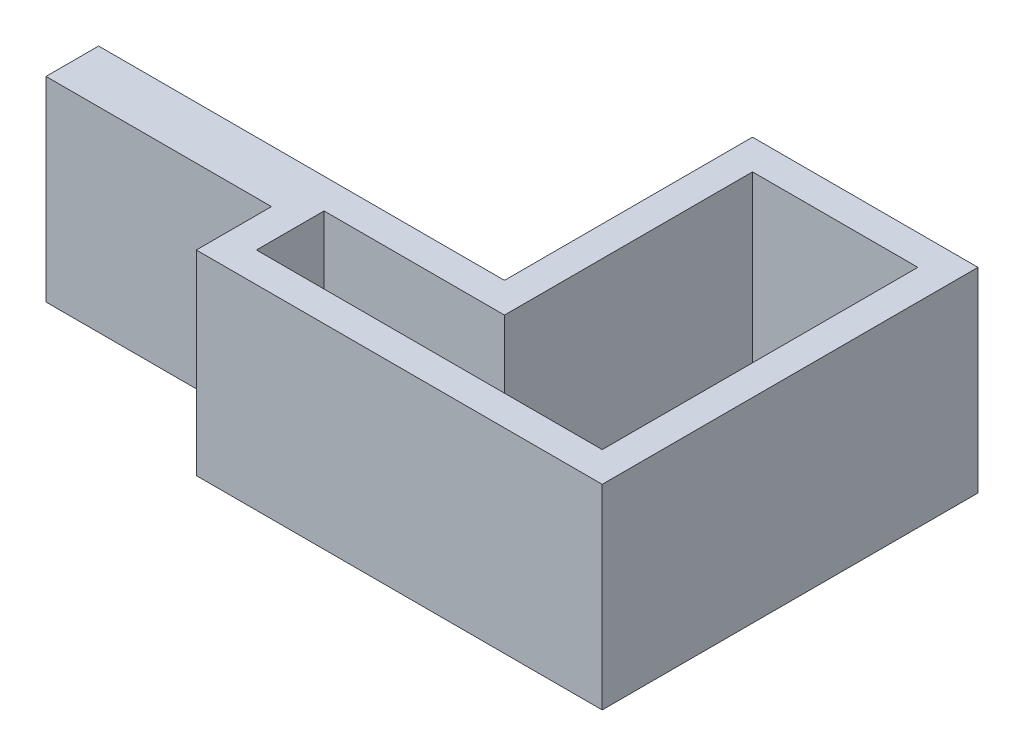
ISO-10303-21;
HEADER;
FILE_DESCRIPTION(('STEP AP214'),'2;1');
FILE_NAME('part.step','',(''),(''),'','','');
FILE_SCHEMA(('AUTOMOTIVE_DESIGN { 1 0 10303 214 1 1 1 1 }'));
ENDSEC;
DATA;
#1=APPLICATION_CONTEXT('core data for automotive mechanical design processes');
#2=APPLICATION_PROTOCOL_DEFINITION('international standard','automotive_design',2000,#1);
#3=PRODUCT_CONTEXT('',#1,'mechanical');
#4=PRODUCT('Part','Part','',(#3));
#5=PRODUCT_RELATED_PRODUCT_CATEGORY('part','',(#4));
#6=PRODUCT_DEFINITION_FORMATION('','',#4);
#7=PRODUCT_DEFINITION_CONTEXT('part definition',#1,'design');
#8=PRODUCT_DEFINITION('design','',#6,#7);
#9=PRODUCT_DEFINITION_SHAPE('','',#8);
#10=(LENGTH_UNIT() NAMED_UNIT(*) SI_UNIT(.MILLI.,.METRE.));
#11=(NAMED_UNIT(*) PLANE_ANGLE_UNIT() SI_UNIT($,.RADIAN.));
#12=(NAMED_UNIT(*) SI_UNIT($,.STERADIAN.) SOLID_ANGLE_UNIT());
#13=UNCERTAINTY_MEASURE_WITH_UNIT(LENGTH_MEASURE(1.E-05),#10,'distance_accuracy_value','');
#14=(GEOMETRIC_REPRESENTATION_CONTEXT(3) GLOBAL_UNCERTAINTY_ASSIGNED_CONTEXT((#13)) GLOBAL_UNIT_ASSIGNED_CONTEXT((#10,
#11,#12)) REPRESENTATION_CONTEXT('',''));
#15=CARTESIAN_POINT('',(0.,0.,0.));
#16=DIRECTION('',(0.,0.,1.));
#17=DIRECTION('',(1.,0.,0.));
#18=AXIS2_PLACEMENT_3D('',#15,#16,#17);
#19=CARTESIAN_POINT('',(0.,13.,22.));
#20=DIRECTION('',(-1.,0.,0.));
#21=DIRECTION('',(0.,0.,-1.));
#22=AXIS2_PLACEMENT_3D('',#19,#20,#21);
#23=PLANE('',#22);
#24=DIRECTION('',(0.,0.,1.));
#25=VECTOR('',#24,1.);
#26=CARTESIAN_POINT('',(0.,0.,22.));
#27=LINE('',#26,#25);
#28=CARTESIAN_POINT('',(0.,0.,11.));
#29=VERTEX_POINT('',#28);
#30=CARTESIAN_POINT('',(0.,0.,36.));
#31=VERTEX_POINT('',#30);
#32=EDGE_CURVE('E250',#29,#31,#27,.T.);
#33=ORIENTED_EDGE('',*,*,#32,.F.);
#34=DIRECTION('',(0.,-1.,0.));
#35=VECTOR('',#34,1.);
#36=CARTESIAN_POINT('',(0.,13.,11.));
#37=LINE('',#36,#35);
#38=CARTESIAN_POINT('',(0.,13.,11.));
#39=VERTEX_POINT('',#38);
#40=EDGE_CURVE('E275',#39,#29,#37,.T.);
#41=ORIENTED_EDGE('',*,*,#40,.F.);
#42=DIRECTION('',(0.,0.,1.));
#43=VECTOR('',#42,1.);
#44=CARTESIAN_POINT('',(0.,13.,22.));
#45=LINE('',#44,#43);
#46=CARTESIAN_POINT('',(0.,13.,36.));
#47=VERTEX_POINT('',#46);
#48=EDGE_CURVE('E251',#39,#47,#45,.T.);
#49=ORIENTED_EDGE('',*,*,#48,.T.);
#50=DIRECTION('',(0.,-1.,0.));
#51=VECTOR('',#50,1.);
#52=CARTESIAN_POINT('',(0.,13.,36.));
#53=LINE('',#52,#51);
#54=EDGE_CURVE('E12',#47,#31,#53,.T.);
#55=ORIENTED_EDGE('',*,*,#54,.T.);
#56=EDGE_LOOP('',(#33,#41,#49,#55));
#57=FACE_BOUND('',#56,.T.);
#58=ADVANCED_FACE('F39',(#57),#23,.F.);
#59=CARTESIAN_POINT('',(0.,13.,36.));
#60=DIRECTION('',(0.,0.,-1.));
#61=DIRECTION('',(1.,0.,0.));
#62=AXIS2_PLACEMENT_3D('',#59,#60,#61);
#63=PLANE('',#62);
#64=DIRECTION('',(-1.,0.,0.));
#65=VECTOR('',#64,1.);
#66=CARTESIAN_POINT('',(0.,0.,36.));
#67=LINE('',#66,#65);
#68=CARTESIAN_POINT('',(-27.,0.,36.));
#69=VERTEX_POINT('',#68);
#70=EDGE_CURVE('E278',#31,#69,#67,.T.);
#71=ORIENTED_EDGE('',*,*,#70,.F.);
#72=ORIENTED_EDGE('',*,*,#54,.F.);
#73=DIRECTION('',(-1.,0.,0.));
#74=VECTOR('',#73,1.);
#75=CARTESIAN_POINT('',(0.,13.,36.));
#76=LINE('',#75,#74);
#77=CARTESIAN_POINT('',(-27.,13.,36.));
#78=VERTEX_POINT('',#77);
#79=EDGE_CURVE('E254',#47,#78,#76,.T.);
#80=ORIENTED_EDGE('',*,*,#79,.T.);
#81=DIRECTION('',(0.,-1.,0.));
#82=VECTOR('',#81,1.);
#83=CARTESIAN_POINT('',(-27.,13.,36.));
#84=LINE('',#83,#82);
#85=EDGE_CURVE('E46',#78,#69,#84,.T.);
#86=ORIENTED_EDGE('',*,*,#85,.T.);
#87=EDGE_LOOP('',(#71,#72,#80,#86));
#88=FACE_BOUND('',#87,.T.);
#89=ADVANCED_FACE('F316',(#88),#63,.F.);
#90=CARTESIAN_POINT('',(-27.,13.,36.));
#91=DIRECTION('',(1.,0.,0.));
#92=DIRECTION('',(0.,0.,1.));
#93=AXIS2_PLACEMENT_3D('',#90,#91,#92);
#94=PLANE('',#93);
#95=DIRECTION('',(0.,0.,-1.));
#96=VECTOR('',#95,1.);
#97=CARTESIAN_POINT('',(-27.,0.,36.));
#98=LINE('',#97,#96);
#99=CARTESIAN_POINT('',(-27.,0.,31.));
#100=VERTEX_POINT('',#99);
#101=EDGE_CURVE('E281',#69,#100,#98,.T.);
#102=ORIENTED_EDGE('',*,*,#101,.F.);
#103=ORIENTED_EDGE('',*,*,#85,.F.);
#104=DIRECTION('',(0.,0.,-1.));
#105=VECTOR('',#104,1.);
#106=CARTESIAN_POINT('',(-27.,13.,36.));
#107=LINE('',#106,#105);
#108=CARTESIAN_POINT('',(-27.,13.,31.));
#109=VERTEX_POINT('',#108);
#110=EDGE_CURVE('E258',#78,#109,#107,.T.);
#111=ORIENTED_EDGE('',*,*,#110,.T.);
#112=DIRECTION('',(0.,-1.,0.));
#113=VECTOR('',#112,1.);
#114=CARTESIAN_POINT('',(-27.,13.,31.));
#115=LINE('',#114,#113);
#116=EDGE_CURVE('E311',#109,#100,#115,.T.);
#117=ORIENTED_EDGE('',*,*,#116,.T.);
#118=EDGE_LOOP('',(#102,#103,#111,#117));
#119=FACE_BOUND('',#118,.T.);
#120=ADVANCED_FACE('F329',(#119),#94,.F.);
#121=CARTESIAN_POINT('',(-27.,13.,31.));
#122=DIRECTION('',(0.,0.,-1.));
#123=DIRECTION('',(1.,0.,0.));
#124=AXIS2_PLACEMENT_3D('',#121,#122,#123);
#125=PLANE('',#124);
#126=DIRECTION('',(-1.,0.,0.));
#127=VECTOR('',#126,1.);
#128=CARTESIAN_POINT('',(-27.,0.,31.));
#129=LINE('',#128,#127);
#130=CARTESIAN_POINT('',(-42.,0.,31.));
#131=VERTEX_POINT('',#130);
#132=EDGE_CURVE('E284',#100,#131,#129,.T.);
#133=ORIENTED_EDGE('',*,*,#132,.F.);
#134=ORIENTED_EDGE('',*,*,#116,.F.);
#135=DIRECTION('',(-1.,0.,0.));
#136=VECTOR('',#135,1.);
#137=CARTESIAN_POINT('',(-27.,13.,31.));
#138=LINE('',#137,#136);
#139=CARTESIAN_POINT('',(-42.,13.,31.));
#140=VERTEX_POINT('',#139);
#141=EDGE_CURVE('E261',#109,#140,#138,.T.);
#142=ORIENTED_EDGE('',*,*,#141,.T.);
#143=DIRECTION('',(0.,-1.,0.));
#144=VECTOR('',#143,1.);
#145=CARTESIAN_POINT('',(-42.,13.,31.));
#146=LINE('',#145,#144);
#147=EDGE_CURVE('E308',#140,#131,#146,.T.);
#148=ORIENTED_EDGE('',*,*,#147,.T.);
#149=EDGE_LOOP('',(#133,#134,#142,#148));
#150=FACE_BOUND('',#149,.T.);
#151=ADVANCED_FACE('F331',(#150),#125,.F.);
#152=CARTESIAN_POINT('',(-42.,13.,31.));
#153=DIRECTION('',(1.,0.,0.));
#154=DIRECTION('',(0.,0.,1.));
#155=AXIS2_PLACEMENT_3D('',#152,#153,#154);
#156=PLANE('',#155);
#157=DIRECTION('',(0.,0.,-1.));
#158=VECTOR('',#157,1.);
#159=CARTESIAN_POINT('',(-42.,0.,31.));
#160=LINE('',#159,#158);
#161=CARTESIAN_POINT('',(-42.,0.,27.5));
#162=VERTEX_POINT('',#161);
#163=EDGE_CURVE('E287',#131,#162,#160,.T.);
#164=ORIENTED_EDGE('',*,*,#163,.F.);
#165=ORIENTED_EDGE('',*,*,#147,.F.);
#166=DIRECTION('',(0.,0.,-1.));
#167=VECTOR('',#166,1.);
#168=CARTESIAN_POINT('',(-42.,13.,31.));
#169=LINE('',#168,#167);
#170=CARTESIAN_POINT('',(-42.,13.,27.5));
#171=VERTEX_POINT('',#170);
#172=EDGE_CURVE('E264',#140,#171,#169,.T.);
#173=ORIENTED_EDGE('',*,*,#172,.T.);
#174=DIRECTION('',(0.,-1.,0.));
#175=VECTOR('',#174,1.);
#176=CARTESIAN_POINT('',(-42.,13.,27.5));
#177=LINE('',#176,#175);
#178=EDGE_CURVE('E305',#171,#162,#177,.T.);
#179=ORIENTED_EDGE('',*,*,#178,.T.);
#180=EDGE_LOOP('',(#164,#165,#173,#179));
#181=FACE_BOUND('',#180,.T.);
#182=ADVANCED_FACE('F334',(#181),#156,.F.);
#183=CARTESIAN_POINT('',(-42.,13.,27.5));
#184=DIRECTION('',(0.,0.,1.));
#185=DIRECTION('',(-1.,0.,0.));
#186=AXIS2_PLACEMENT_3D('',#183,#184,#185);
#187=PLANE('',#186);
#188=DIRECTION('',(1.,0.,0.));
#189=VECTOR('',#188,1.);
#190=CARTESIAN_POINT('',(-42.,0.,27.5));
#191=LINE('',#190,#189);
#192=CARTESIAN_POINT('',(-15.,0.,27.5));
#193=VERTEX_POINT('',#192);
#194=EDGE_CURVE('E290',#162,#193,#191,.T.);
#195=ORIENTED_EDGE('',*,*,#194,.F.);
#196=ORIENTED_EDGE('',*,*,#178,.F.);
#197=DIRECTION('',(1.,0.,0.));
#198=VECTOR('',#197,1.);
#199=CARTESIAN_POINT('',(-42.,13.,27.5));
#200=LINE('',#199,#198);
#201=CARTESIAN_POINT('',(-15.,13.,27.5));
#202=VERTEX_POINT('',#201);
#203=EDGE_CURVE('E267',#171,#202,#200,.T.);
#204=ORIENTED_EDGE('',*,*,#203,.T.);
#205=DIRECTION('',(0.,-1.,0.));
#206=VECTOR('',#205,1.);
#207=CARTESIAN_POINT('',(-15.,13.,27.5));
#208=LINE('',#207,#206);
#209=EDGE_CURVE('E302',#202,#193,#208,.T.);
#210=ORIENTED_EDGE('',*,*,#209,.T.);
#211=EDGE_LOOP('',(#195,#196,#204,#210));
#212=FACE_BOUND('',#211,.T.);
#213=ADVANCED_FACE('F337',(#212),#187,.F.);
#214=CARTESIAN_POINT('',(-15.,13.,11.));
#215=DIRECTION('',(1.,0.,0.));
#216=DIRECTION('',(0.,0.,1.));
#217=AXIS2_PLACEMENT_3D('',#214,#215,#216);
#218=PLANE('',#217);
#219=DIRECTION('',(0.,0.,-1.));
#220=VECTOR('',#219,1.);
#221=CARTESIAN_POINT('',(-15.,0.,11.));
#222=LINE('',#221,#220);
#223=CARTESIAN_POINT('',(-15.,0.,11.));
#224=VERTEX_POINT('',#223);
#225=EDGE_CURVE('E293',#193,#224,#222,.T.);
#226=ORIENTED_EDGE('',*,*,#225,.F.);
#227=ORIENTED_EDGE('',*,*,#209,.F.);
#228=DIRECTION('',(0.,0.,-1.));
#229=VECTOR('',#228,1.);
#230=CARTESIAN_POINT('',(-15.,13.,11.));
#231=LINE('',#230,#229);
#232=CARTESIAN_POINT('',(-15.,13.,11.));
#233=VERTEX_POINT('',#232);
#234=EDGE_CURVE('E270',#202,#233,#231,.T.);
#235=ORIENTED_EDGE('',*,*,#234,.T.);
#236=DIRECTION('',(0.,-1.,0.));
#237=VECTOR('',#236,1.);
#238=CARTESIAN_POINT('',(-15.,13.,11.));
#239=LINE('',#238,#237);
#240=EDGE_CURVE('E299',#233,#224,#239,.T.);
#241=ORIENTED_EDGE('',*,*,#240,.T.);
#242=EDGE_LOOP('',(#226,#227,#235,#241));
#243=FACE_BOUND('',#242,.T.);
#244=ADVANCED_FACE('F340',(#243),#218,.F.);
#245=CARTESIAN_POINT('',(0.,13.,11.));
#246=DIRECTION('',(0.,0.,1.));
#247=DIRECTION('',(-1.,0.,0.));
#248=AXIS2_PLACEMENT_3D('',#245,#246,#247);
#249=PLANE('',#248);
#250=DIRECTION('',(1.,0.,0.));
#251=VECTOR('',#250,1.);
#252=CARTESIAN_POINT('',(0.,0.,11.));
#253=LINE('',#252,#251);
#254=EDGE_CURVE('E255',#224,#29,#253,.T.);
#255=ORIENTED_EDGE('',*,*,#254,.F.);
#256=ORIENTED_EDGE('',*,*,#240,.F.);
#257=DIRECTION('',(1.,0.,0.));
#258=VECTOR('',#257,1.);
#259=CARTESIAN_POINT('',(0.,13.,11.));
#260=LINE('',#259,#258);
#261=EDGE_CURVE('E273',#233,#39,#260,.T.);
#262=ORIENTED_EDGE('',*,*,#261,.T.);
#263=ORIENTED_EDGE('',*,*,#40,.T.);
#264=EDGE_LOOP('',(#255,#256,#262,#263));
#265=FACE_BOUND('',#264,.T.);
#266=ADVANCED_FACE('F342',(#265),#249,.F.);
#267=CARTESIAN_POINT('',(0.,13.,22.));
#268=DIRECTION('',(0.,-1.,0.));
#269=DIRECTION('',(0.,0.,1.));
#270=AXIS2_PLACEMENT_3D('',#267,#268,#269);
#271=PLANE('',#270);
#272=DIRECTION('',(0.,0.,-1.));
#273=VECTOR('',#272,1.);
#274=CARTESIAN_POINT('',(-25.,13.,34.));
#275=LINE('',#274,#273);
#276=CARTESIAN_POINT('',(-25.,13.,34.));
#277=VERTEX_POINT('',#276);
#278=CARTESIAN_POINT('',(-25.,13.,29.5));
#279=VERTEX_POINT('',#278);
#280=EDGE_CURVE('E213',#277,#279,#275,.T.);
#281=ORIENTED_EDGE('',*,*,#280,.T.);
#282=DIRECTION('',(1.,0.,0.));
#283=VECTOR('',#282,1.);
#284=CARTESIAN_POINT('',(-25.,13.,29.5));
#285=LINE('',#284,#283);
#286=CARTESIAN_POINT('',(-13.,13.,29.5));
#287=VERTEX_POINT('',#286);
#288=EDGE_CURVE('E210',#279,#287,#285,.T.);
#289=ORIENTED_EDGE('',*,*,#288,.T.);
#290=DIRECTION('',(0.,0.,-1.));
#291=VECTOR('',#290,1.);
#292=CARTESIAN_POINT('',(-13.,13.,29.5));
#293=LINE('',#292,#291);
#294=CARTESIAN_POINT('',(-13.,13.,13.));
#295=VERTEX_POINT('',#294);
#296=EDGE_CURVE('E207',#287,#295,#293,.T.);
#297=ORIENTED_EDGE('',*,*,#296,.T.);
#298=DIRECTION('',(1.,0.,0.));
#299=VECTOR('',#298,1.);
#300=CARTESIAN_POINT('',(-13.,13.,13.));
#301=LINE('',#300,#299);
#302=CARTESIAN_POINT('',(-2.,13.,13.));
#303=VERTEX_POINT('',#302);
#304=EDGE_CURVE('E203',#295,#303,#301,.T.);
#305=ORIENTED_EDGE('',*,*,#304,.T.);
#306=DIRECTION('',(0.,0.,1.));
#307=VECTOR('',#306,1.);
#308=CARTESIAN_POINT('',(-2.,13.,13.));
#309=LINE('',#308,#307);
#310=CARTESIAN_POINT('',(-2.,13.,34.));
#311=VERTEX_POINT('',#310);
#312=EDGE_CURVE('E202',#303,#311,#309,.T.);
#313=ORIENTED_EDGE('',*,*,#312,.T.);
#314=DIRECTION('',(-1.,0.,0.));
#315=VECTOR('',#314,1.);
#316=CARTESIAN_POINT('',(-2.,13.,34.));
#317=LINE('',#316,#315);
#318=EDGE_CURVE('E216',#311,#277,#317,.T.);
#319=ORIENTED_EDGE('',*,*,#318,.T.);
#320=EDGE_LOOP('',(#281,#289,#297,#305,#313,#319));
#321=FACE_BOUND('',#320,.T.);
#322=ORIENTED_EDGE('',*,*,#48,.F.);
#323=ORIENTED_EDGE('',*,*,#261,.F.);
#324=ORIENTED_EDGE('',*,*,#234,.F.);
#325=ORIENTED_EDGE('',*,*,#203,.F.);
#326=ORIENTED_EDGE('',*,*,#172,.F.);
#327=ORIENTED_EDGE('',*,*,#141,.F.);
#328=ORIENTED_EDGE('',*,*,#110,.F.);
#329=ORIENTED_EDGE('',*,*,#79,.F.);
#330=EDGE_LOOP('',(#322,#323,#324,#325,#326,#327,#328,#329));
#331=FACE_BOUND('',#330,.T.);
#332=ADVANCED_FACE('F326',(#321,#331),#271,.F.);
#333=CARTESIAN_POINT('',(0.,0.,22.));
#334=DIRECTION('',(0.,-1.,0.));
#335=DIRECTION('',(0.,0.,1.));
#336=AXIS2_PLACEMENT_3D('',#333,#334,#335);
#337=PLANE('',#336);
#338=CARTESIAN_POINT('',(-7.5,0.,30.));
#339=DIRECTION('',(0.,1.,0.));
#340=DIRECTION('',(0.,0.,1.));
#341=AXIS2_PLACEMENT_3D('',#338,#339,#340);
#342=CIRCLE('',#341,1.65);
#343=CARTESIAN_POINT('',(-7.5,0.,31.65));
#344=VERTEX_POINT('',#343);
#345=EDGE_CURVE('E184',#344,#344,#342,.T.);
#346=ORIENTED_EDGE('',*,*,#345,.T.);
#347=EDGE_LOOP('',(#346));
#348=FACE_BOUND('',#347,.T.);
#349=CARTESIAN_POINT('',(-7.5,0.,17.));
#350=DIRECTION('',(0.,1.,0.));
#351=DIRECTION('',(0.,0.,1.));
#352=AXIS2_PLACEMENT_3D('',#349,#350,#351);
#353=CIRCLE('',#352,1.65);
#354=CARTESIAN_POINT('',(-7.5,0.,18.65));
#355=VERTEX_POINT('',#354);
#356=EDGE_CURVE('E527',#355,#355,#353,.T.);
#357=ORIENTED_EDGE('',*,*,#356,.T.);
#358=EDGE_LOOP('',(#357));
#359=FACE_BOUND('',#358,.T.);
#360=DIRECTION('',(0.,0.,1.));
#361=VECTOR('',#360,1.);
#362=CARTESIAN_POINT('',(-23.,0.,22.));
#363=LINE('',#362,#361);
#364=CARTESIAN_POINT('',(-23.,0.,31.));
#365=VERTEX_POINT('',#364);
#366=CARTESIAN_POINT('',(-23.,0.,33.));
#367=VERTEX_POINT('',#366);
#368=EDGE_CURVE('E199',#365,#367,#363,.T.);
#369=ORIENTED_EDGE('',*,*,#368,.T.);
#370=DIRECTION('',(1.,0.,0.));
#371=VECTOR('',#370,1.);
#372=CARTESIAN_POINT('',(0.,0.,33.));
#373=LINE('',#372,#371);
#374=CARTESIAN_POINT('',(-9.,0.,33.));
#375=VERTEX_POINT('',#374);
#376=EDGE_CURVE('E196',#367,#375,#373,.T.);
#377=ORIENTED_EDGE('',*,*,#376,.T.);
#378=DIRECTION('',(0.,0.,-1.));
#379=VECTOR('',#378,1.);
#380=CARTESIAN_POINT('',(-8.99999999999998,0.,22.));
#381=LINE('',#380,#379);
#382=CARTESIAN_POINT('',(-9.,0.,31.));
#383=VERTEX_POINT('',#382);
#384=EDGE_CURVE('E194',#375,#383,#381,.T.);
#385=ORIENTED_EDGE('',*,*,#384,.T.);
#386=DIRECTION('',(-1.,0.,0.));
#387=VECTOR('',#386,1.);
#388=CARTESIAN_POINT('',(0.,0.,31.));
#389=LINE('',#388,#387);
#390=EDGE_CURVE('E168',#383,#365,#389,.T.);
#391=ORIENTED_EDGE('',*,*,#390,.T.);
#392=EDGE_LOOP('',(#369,#377,#385,#391));
#393=FACE_BOUND('',#392,.T.);
#394=ORIENTED_EDGE('',*,*,#32,.T.);
#395=ORIENTED_EDGE('',*,*,#70,.T.);
#396=ORIENTED_EDGE('',*,*,#101,.T.);
#397=ORIENTED_EDGE('',*,*,#132,.T.);
#398=ORIENTED_EDGE('',*,*,#163,.T.);
#399=ORIENTED_EDGE('',*,*,#194,.T.);
#400=ORIENTED_EDGE('',*,*,#225,.T.);
#401=ORIENTED_EDGE('',*,*,#254,.T.);
#402=EDGE_LOOP('',(#394,#395,#396,#397,#398,#399,#400,#401));
#403=FACE_BOUND('',#402,.T.);
#404=ADVANCED_FACE('F320',(#348,#359,#393,#403),#337,.T.);
#405=CARTESIAN_POINT('',(0.,2.,22.));
#406=DIRECTION('',(0.,-1.,0.));
#407=DIRECTION('',(0.,0.,1.));
#408=AXIS2_PLACEMENT_3D('',#405,#406,#407);
#409=PLANE('',#408);
#410=CARTESIAN_POINT('',(-7.5,2.,30.));
#411=DIRECTION('',(0.,-1.,0.));
#412=DIRECTION('',(0.,0.,-1.));
#413=AXIS2_PLACEMENT_3D('',#410,#411,#412);
#414=CIRCLE('',#413,1.65);
#415=CARTESIAN_POINT('',(-7.5,2.,28.35));
#416=VERTEX_POINT('',#415);
#417=EDGE_CURVE('E526',#416,#416,#414,.T.);
#418=ORIENTED_EDGE('',*,*,#417,.T.);
#419=EDGE_LOOP('',(#418));
#420=FACE_BOUND('',#419,.T.);
#421=CARTESIAN_POINT('',(-7.5,2.,17.));
#422=DIRECTION('',(0.,-1.,0.));
#423=DIRECTION('',(0.,0.,-1.));
#424=AXIS2_PLACEMENT_3D('',#421,#422,#423);
#425=CIRCLE('',#424,1.65);
#426=CARTESIAN_POINT('',(-7.5,2.,15.35));
#427=VERTEX_POINT('',#426);
#428=EDGE_CURVE('E528',#427,#427,#425,.T.);
#429=ORIENTED_EDGE('',*,*,#428,.T.);
#430=EDGE_LOOP('',(#429));
#431=FACE_BOUND('',#430,.T.);
#432=DIRECTION('',(1.,0.,0.));
#433=VECTOR('',#432,1.);
#434=CARTESIAN_POINT('',(-23.,2.,31.));
#435=LINE('',#434,#433);
#436=CARTESIAN_POINT('',(-23.,2.,31.));
#437=VERTEX_POINT('',#436);
#438=CARTESIAN_POINT('',(-9.,2.,31.));
#439=VERTEX_POINT('',#438);
#440=EDGE_CURVE('E166',#437,#439,#435,.T.);
#441=ORIENTED_EDGE('',*,*,#440,.T.);
#442=DIRECTION('',(0.,0.,1.));
#443=VECTOR('',#442,1.);
#444=CARTESIAN_POINT('',(-9.,2.,33.));
#445=LINE('',#444,#443);
#446=CARTESIAN_POINT('',(-9.,2.,33.));
#447=VERTEX_POINT('',#446);
#448=EDGE_CURVE('E173',#439,#447,#445,.T.);
#449=ORIENTED_EDGE('',*,*,#448,.T.);
#450=DIRECTION('',(-1.,0.,0.));
#451=VECTOR('',#450,1.);
#452=CARTESIAN_POINT('',(-23.,2.,33.));
#453=LINE('',#452,#451);
#454=CARTESIAN_POINT('',(-23.,2.,33.));
#455=VERTEX_POINT('',#454);
#456=EDGE_CURVE('E178',#447,#455,#453,.T.);
#457=ORIENTED_EDGE('',*,*,#456,.T.);
#458=DIRECTION('',(0.,0.,-1.));
#459=VECTOR('',#458,1.);
#460=CARTESIAN_POINT('',(-23.,2.,33.));
#461=LINE('',#460,#459);
#462=EDGE_CURVE('E182',#455,#437,#461,.T.);
#463=ORIENTED_EDGE('',*,*,#462,.T.);
#464=EDGE_LOOP('',(#441,#449,#457,#463));
#465=FACE_BOUND('',#464,.T.);
#466=DIRECTION('',(0.,0.,1.));
#467=VECTOR('',#466,1.);
#468=CARTESIAN_POINT('',(-2.,2.,13.));
#469=LINE('',#468,#467);
#470=CARTESIAN_POINT('',(-2.,2.,13.));
#471=VERTEX_POINT('',#470);
#472=CARTESIAN_POINT('',(-2.,2.,34.));
#473=VERTEX_POINT('',#472);
#474=EDGE_CURVE('E224',#471,#473,#469,.T.);
#475=ORIENTED_EDGE('',*,*,#474,.F.);
#476=DIRECTION('',(1.,0.,0.));
#477=VECTOR('',#476,1.);
#478=CARTESIAN_POINT('',(-13.,2.,13.));
#479=LINE('',#478,#477);
#480=CARTESIAN_POINT('',(-13.,2.,13.));
#481=VERTEX_POINT('',#480);
#482=EDGE_CURVE('E229',#481,#471,#479,.T.);
#483=ORIENTED_EDGE('',*,*,#482,.F.);
#484=DIRECTION('',(0.,0.,-1.));
#485=VECTOR('',#484,1.);
#486=CARTESIAN_POINT('',(-13.,2.,29.5));
#487=LINE('',#486,#485);
#488=CARTESIAN_POINT('',(-13.,2.,29.5));
#489=VERTEX_POINT('',#488);
#490=EDGE_CURVE('E233',#489,#481,#487,.T.);
#491=ORIENTED_EDGE('',*,*,#490,.F.);
#492=DIRECTION('',(1.,0.,0.));
#493=VECTOR('',#492,1.);
#494=CARTESIAN_POINT('',(-25.,2.,29.5));
#495=LINE('',#494,#493);
#496=CARTESIAN_POINT('',(-25.,2.,29.5));
#497=VERTEX_POINT('',#496);
#498=EDGE_CURVE('E237',#497,#489,#495,.T.);
#499=ORIENTED_EDGE('',*,*,#498,.F.);
#500=DIRECTION('',(0.,0.,-1.));
#501=VECTOR('',#500,1.);
#502=CARTESIAN_POINT('',(-25.,2.,34.));
#503=LINE('',#502,#501);
#504=CARTESIAN_POINT('',(-25.,2.,34.));
#505=VERTEX_POINT('',#504);
#506=EDGE_CURVE('E241',#505,#497,#503,.T.);
#507=ORIENTED_EDGE('',*,*,#506,.F.);
#508=DIRECTION('',(-1.,0.,0.));
#509=VECTOR('',#508,1.);
#510=CARTESIAN_POINT('',(-2.,2.,34.));
#511=LINE('',#510,#509);
#512=EDGE_CURVE('E206',#473,#505,#511,.T.);
#513=ORIENTED_EDGE('',*,*,#512,.F.);
#514=EDGE_LOOP('',(#475,#483,#491,#499,#507,#513));
#515=FACE_BOUND('',#514,.T.);
#516=ADVANCED_FACE('F180',(#420,#431,#465,#515),#409,.F.);
#517=CARTESIAN_POINT('',(-2.,-31.1448230047949,34.));
#518=DIRECTION('',(0.,0.,1.));
#519=DIRECTION('',(-1.,0.,0.));
#520=AXIS2_PLACEMENT_3D('',#517,#518,#519);
#521=PLANE('',#520);
#522=DIRECTION('',(0.,1.,0.));
#523=VECTOR('',#522,1.);
#524=CARTESIAN_POINT('',(-2.,-31.1448230047949,34.));
#525=LINE('',#524,#523);
#526=EDGE_CURVE('E227',#473,#311,#525,.T.);
#527=ORIENTED_EDGE('',*,*,#526,.F.);
#528=ORIENTED_EDGE('',*,*,#512,.T.);
#529=DIRECTION('',(0.,1.,0.));
#530=VECTOR('',#529,1.);
#531=CARTESIAN_POINT('',(-25.,-31.1448230047949,34.));
#532=LINE('',#531,#530);
#533=EDGE_CURVE('E223',#505,#277,#532,.T.);
#534=ORIENTED_EDGE('',*,*,#533,.T.);
#535=ORIENTED_EDGE('',*,*,#318,.F.);
#536=EDGE_LOOP('',(#527,#528,#534,#535));
#537=FACE_BOUND('',#536,.T.);
#538=ADVANCED_FACE('F402',(#537),#521,.F.);
#539=CARTESIAN_POINT('',(-25.,-31.1448230047949,34.));
#540=DIRECTION('',(-1.,0.,0.));
#541=DIRECTION('',(0.,0.,-1.));
#542=AXIS2_PLACEMENT_3D('',#539,#540,#541);
#543=PLANE('',#542);
#544=ORIENTED_EDGE('',*,*,#533,.F.);
#545=ORIENTED_EDGE('',*,*,#506,.T.);
#546=DIRECTION('',(0.,1.,0.));
#547=VECTOR('',#546,1.);
#548=CARTESIAN_POINT('',(-25.,-31.1448230047949,29.5));
#549=LINE('',#548,#547);
#550=EDGE_CURVE('E240',#497,#279,#549,.T.);
#551=ORIENTED_EDGE('',*,*,#550,.T.);
#552=ORIENTED_EDGE('',*,*,#280,.F.);
#553=EDGE_LOOP('',(#544,#545,#551,#552));
#554=FACE_BOUND('',#553,.T.);
#555=ADVANCED_FACE('F412',(#554),#543,.F.);
#556=CARTESIAN_POINT('',(-25.,-31.1448230047949,29.5));
#557=DIRECTION('',(0.,0.,-1.));
#558=DIRECTION('',(1.,0.,0.));
#559=AXIS2_PLACEMENT_3D('',#556,#557,#558);
#560=PLANE('',#559);
#561=ORIENTED_EDGE('',*,*,#550,.F.);
#562=ORIENTED_EDGE('',*,*,#498,.T.);
#563=DIRECTION('',(0.,1.,0.));
#564=VECTOR('',#563,1.);
#565=CARTESIAN_POINT('',(-13.,-31.1448230047949,29.5));
#566=LINE('',#565,#564);
#567=EDGE_CURVE('E236',#489,#287,#566,.T.);
#568=ORIENTED_EDGE('',*,*,#567,.T.);
#569=ORIENTED_EDGE('',*,*,#288,.F.);
#570=EDGE_LOOP('',(#561,#562,#568,#569));
#571=FACE_BOUND('',#570,.T.);
#572=ADVANCED_FACE('F422',(#571),#560,.F.);
#573=CARTESIAN_POINT('',(-13.,-31.1448230047949,29.5));
#574=DIRECTION('',(-1.,0.,0.));
#575=DIRECTION('',(0.,0.,-1.));
#576=AXIS2_PLACEMENT_3D('',#573,#574,#575);
#577=PLANE('',#576);
#578=ORIENTED_EDGE('',*,*,#567,.F.);
#579=ORIENTED_EDGE('',*,*,#490,.T.);
#580=DIRECTION('',(0.,1.,0.));
#581=VECTOR('',#580,1.);
#582=CARTESIAN_POINT('',(-13.,-31.1448230047949,13.));
#583=LINE('',#582,#581);
#584=EDGE_CURVE('E232',#481,#295,#583,.T.);
#585=ORIENTED_EDGE('',*,*,#584,.T.);
#586=ORIENTED_EDGE('',*,*,#296,.F.);
#587=EDGE_LOOP('',(#578,#579,#585,#586));
#588=FACE_BOUND('',#587,.T.);
#589=ADVANCED_FACE('F432',(#588),#577,.F.);
#590=CARTESIAN_POINT('',(-13.,-31.1448230047949,13.));
#591=DIRECTION('',(0.,0.,-1.));
#592=DIRECTION('',(1.,0.,0.));
#593=AXIS2_PLACEMENT_3D('',#590,#591,#592);
#594=PLANE('',#593);
#595=ORIENTED_EDGE('',*,*,#584,.F.);
#596=ORIENTED_EDGE('',*,*,#482,.T.);
#597=DIRECTION('',(0.,1.,0.));
#598=VECTOR('',#597,1.);
#599=CARTESIAN_POINT('',(-2.,-31.1448230047949,13.));
#600=LINE('',#599,#598);
#601=EDGE_CURVE('E228',#471,#303,#600,.T.);
#602=ORIENTED_EDGE('',*,*,#601,.T.);
#603=ORIENTED_EDGE('',*,*,#304,.F.);
#604=EDGE_LOOP('',(#595,#596,#602,#603));
#605=FACE_BOUND('',#604,.T.);
#606=ADVANCED_FACE('F442',(#605),#594,.F.);
#607=CARTESIAN_POINT('',(-2.,-31.1448230047949,13.));
#608=DIRECTION('',(1.,0.,0.));
#609=DIRECTION('',(0.,0.,1.));
#610=AXIS2_PLACEMENT_3D('',#607,#608,#609);
#611=PLANE('',#610);
#612=ORIENTED_EDGE('',*,*,#601,.F.);
#613=ORIENTED_EDGE('',*,*,#474,.T.);
#614=ORIENTED_EDGE('',*,*,#526,.T.);
#615=ORIENTED_EDGE('',*,*,#312,.F.);
#616=EDGE_LOOP('',(#612,#613,#614,#615));
#617=FACE_BOUND('',#616,.T.);
#618=ADVANCED_FACE('F452',(#617),#611,.F.);
#619=CARTESIAN_POINT('',(-23.,-8.,33.));
#620=DIRECTION('',(-1.,0.,0.));
#621=DIRECTION('',(0.,0.,-1.));
#622=AXIS2_PLACEMENT_3D('',#619,#620,#621);
#623=PLANE('',#622);
#624=ORIENTED_EDGE('',*,*,#368,.F.);
#625=DIRECTION('',(0.,1.,0.));
#626=VECTOR('',#625,1.);
#627=CARTESIAN_POINT('',(-23.,-8.,31.));
#628=LINE('',#627,#626);
#629=EDGE_CURVE('E61',#365,#437,#628,.T.);
#630=ORIENTED_EDGE('',*,*,#629,.T.);
#631=ORIENTED_EDGE('',*,*,#462,.F.);
#632=DIRECTION('',(0.,1.,0.));
#633=VECTOR('',#632,1.);
#634=CARTESIAN_POINT('',(-23.,-8.,33.));
#635=LINE('',#634,#633);
#636=EDGE_CURVE('E189',#367,#455,#635,.T.);
#637=ORIENTED_EDGE('',*,*,#636,.F.);
#638=EDGE_LOOP('',(#624,#630,#631,#637));
#639=FACE_BOUND('',#638,.T.);
#640=ADVANCED_FACE('F462',(#639),#623,.F.);
#641=CARTESIAN_POINT('',(-23.,-8.,33.));
#642=DIRECTION('',(0.,0.,1.));
#643=DIRECTION('',(-1.,0.,0.));
#644=AXIS2_PLACEMENT_3D('',#641,#642,#643);
#645=PLANE('',#644);
#646=ORIENTED_EDGE('',*,*,#376,.F.);
#647=ORIENTED_EDGE('',*,*,#636,.T.);
#648=ORIENTED_EDGE('',*,*,#456,.F.);
#649=DIRECTION('',(0.,1.,0.));
#650=VECTOR('',#649,1.);
#651=CARTESIAN_POINT('',(-9.,-8.,33.));
#652=LINE('',#651,#650);
#653=EDGE_CURVE('E170',#375,#447,#652,.T.);
#654=ORIENTED_EDGE('',*,*,#653,.F.);
#655=EDGE_LOOP('',(#646,#647,#648,#654));
#656=FACE_BOUND('',#655,.T.);
#657=ADVANCED_FACE('F472',(#656),#645,.F.);
#658=CARTESIAN_POINT('',(-9.,-8.,33.));
#659=DIRECTION('',(1.,0.,0.));
#660=DIRECTION('',(0.,0.,1.));
#661=AXIS2_PLACEMENT_3D('',#658,#659,#660);
#662=PLANE('',#661);
#663=ORIENTED_EDGE('',*,*,#384,.F.);
#664=ORIENTED_EDGE('',*,*,#653,.T.);
#665=ORIENTED_EDGE('',*,*,#448,.F.);
#666=DIRECTION('',(0.,1.,0.));
#667=VECTOR('',#666,1.);
#668=CARTESIAN_POINT('',(-9.,-8.,31.));
#669=LINE('',#668,#667);
#670=EDGE_CURVE('E53',#383,#439,#669,.T.);
#671=ORIENTED_EDGE('',*,*,#670,.F.);
#672=EDGE_LOOP('',(#663,#664,#665,#671));
#673=FACE_BOUND('',#672,.T.);
#674=ADVANCED_FACE('F174',(#673),#662,.F.);
#675=CARTESIAN_POINT('',(-23.,-8.,31.));
#676=DIRECTION('',(0.,0.,-1.));
#677=DIRECTION('',(1.,0.,0.));
#678=AXIS2_PLACEMENT_3D('',#675,#676,#677);
#679=PLANE('',#678);
#680=ORIENTED_EDGE('',*,*,#390,.F.);
#681=ORIENTED_EDGE('',*,*,#670,.T.);
#682=ORIENTED_EDGE('',*,*,#440,.F.);
#683=ORIENTED_EDGE('',*,*,#629,.F.);
#684=EDGE_LOOP('',(#680,#681,#682,#683));
#685=FACE_BOUND('',#684,.T.);
#686=ADVANCED_FACE('F164',(#685),#679,.F.);
#687=CARTESIAN_POINT('',(-7.5,-18.,17.));
#688=DIRECTION('',(0.,1.,0.));
#689=DIRECTION('',(0.,0.,-1.));
#690=AXIS2_PLACEMENT_3D('',#687,#688,#689);
#691=CYLINDRICAL_SURFACE('',#690,1.65);
#692=ORIENTED_EDGE('',*,*,#356,.F.);
#693=EDGE_LOOP('',(#692));
#694=FACE_BOUND('',#693,.T.);
#695=ORIENTED_EDGE('',*,*,#428,.F.);
#696=EDGE_LOOP('',(#695));
#697=FACE_BOUND('',#696,.T.);
#698=ADVANCED_FACE('F498',(#694,#697),#691,.F.);
#699=CARTESIAN_POINT('',(-7.5,-18.,30.));
#700=DIRECTION('',(0.,1.,0.));
#701=DIRECTION('',(0.,0.,-1.));
#702=AXIS2_PLACEMENT_3D('',#699,#700,#701);
#703=CYLINDRICAL_SURFACE('',#702,1.65);
#704=ORIENTED_EDGE('',*,*,#345,.F.);
#705=EDGE_LOOP('',(#704));
#706=FACE_BOUND('',#705,.T.);
#707=ORIENTED_EDGE('',*,*,#417,.F.);
#708=EDGE_LOOP('',(#707));
#709=FACE_BOUND('',#708,.T.);
#710=ADVANCED_FACE('F507',(#706,#709),#703,.F.);
#711=CLOSED_SHELL('',(#58,#89,#120,#151,#182,#213,#244,#266,#332,#404,#516,#538,#555,#572,#589,
#606,#618,#640,#657,#674,#686,#698,#710));
#712=MANIFOLD_SOLID_BREP('B2',#711);
#713=ADVANCED_BREP_SHAPE_REPRESENTATION('',(#18,#712),#14);
#714=SHAPE_DEFINITION_REPRESENTATION(#9,#713);
ENDSEC;
END-ISO-10303-21;
